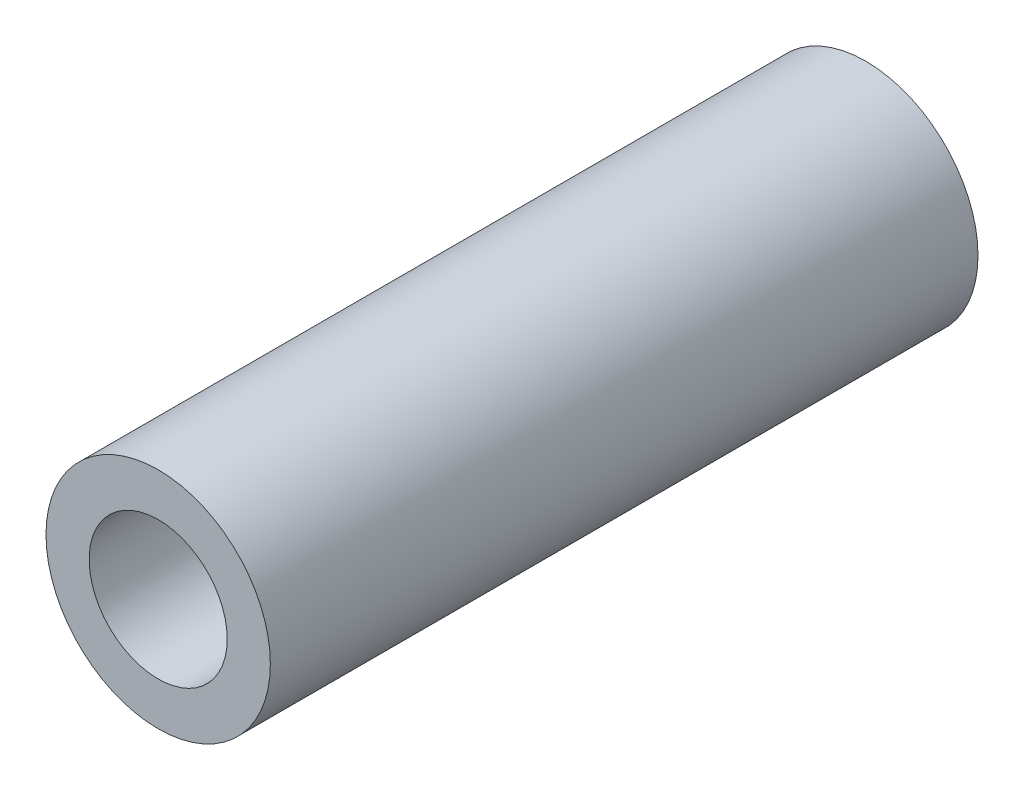
ISO-10303-21;
HEADER;
FILE_DESCRIPTION(('STEP AP214'),'2;1');
FILE_NAME('part.step','',(''),(''),'','','');
FILE_SCHEMA(('AUTOMOTIVE_DESIGN { 1 0 10303 214 1 1 1 1 }'));
ENDSEC;
DATA;
#1=APPLICATION_CONTEXT('core data for automotive mechanical design processes');
#2=APPLICATION_PROTOCOL_DEFINITION('international standard','automotive_design',2000,#1);
#3=PRODUCT_CONTEXT('',#1,'mechanical');
#4=PRODUCT('Part','Part','',(#3));
#5=PRODUCT_RELATED_PRODUCT_CATEGORY('part','',(#4));
#6=PRODUCT_DEFINITION_FORMATION('','',#4);
#7=PRODUCT_DEFINITION_CONTEXT('part definition',#1,'design');
#8=PRODUCT_DEFINITION('design','',#6,#7);
#9=PRODUCT_DEFINITION_SHAPE('','',#8);
#10=(LENGTH_UNIT() NAMED_UNIT(*) SI_UNIT(.MILLI.,.METRE.));
#11=(NAMED_UNIT(*) PLANE_ANGLE_UNIT() SI_UNIT($,.RADIAN.));
#12=(NAMED_UNIT(*) SI_UNIT($,.STERADIAN.) SOLID_ANGLE_UNIT());
#13=UNCERTAINTY_MEASURE_WITH_UNIT(LENGTH_MEASURE(1.E-05),#10,'distance_accuracy_value','');
#14=(GEOMETRIC_REPRESENTATION_CONTEXT(3) GLOBAL_UNCERTAINTY_ASSIGNED_CONTEXT((#13)) GLOBAL_UNIT_ASSIGNED_CONTEXT((#10,
#11,#12)) REPRESENTATION_CONTEXT('',''));
#15=CARTESIAN_POINT('',(0.,0.,0.));
#16=DIRECTION('',(0.,0.,1.));
#17=DIRECTION('',(1.,0.,0.));
#18=AXIS2_PLACEMENT_3D('',#15,#16,#17);
#19=CARTESIAN_POINT('',(-12.75,-12.75,22.));
#20=DIRECTION('',(0.,0.,1.));
#21=DIRECTION('',(1.,0.,0.));
#22=AXIS2_PLACEMENT_3D('',#19,#20,#21);
#23=PLANE('',#22);
#24=CARTESIAN_POINT('',(-12.75,-12.75,22.));
#25=DIRECTION('',(0.,0.,1.));
#26=DIRECTION('',(1.,0.,0.));
#27=AXIS2_PLACEMENT_3D('',#24,#25,#26);
#28=CIRCLE('',#27,1.6);
#29=CARTESIAN_POINT('',(-11.15,-12.75,22.));
#30=VERTEX_POINT('',#29);
#31=EDGE_CURVE('E23',#30,#30,#28,.T.);
#32=ORIENTED_EDGE('',*,*,#31,.F.);
#33=EDGE_LOOP('',(#32));
#34=FACE_BOUND('',#33,.T.);
#35=CARTESIAN_POINT('',(-12.75,-12.75,22.));
#36=DIRECTION('',(0.,0.,1.));
#37=DIRECTION('',(1.,0.,0.));
#38=AXIS2_PLACEMENT_3D('',#35,#36,#37);
#39=CIRCLE('',#38,2.6);
#40=CARTESIAN_POINT('',(-10.15,-12.75,22.));
#41=VERTEX_POINT('',#40);
#42=EDGE_CURVE('E57',#41,#41,#39,.T.);
#43=ORIENTED_EDGE('',*,*,#42,.T.);
#44=EDGE_LOOP('',(#43));
#45=FACE_BOUND('',#44,.T.);
#46=ADVANCED_FACE('F15',(#34,#45),#23,.T.);
#47=CARTESIAN_POINT('',(-12.75,-12.75,5.6));
#48=DIRECTION('',(0.,0.,1.));
#49=DIRECTION('',(1.,0.,0.));
#50=AXIS2_PLACEMENT_3D('',#47,#48,#49);
#51=PLANE('',#50);
#52=CARTESIAN_POINT('',(-12.75,-12.75,5.6));
#53=DIRECTION('',(0.,0.,1.));
#54=DIRECTION('',(1.,0.,0.));
#55=AXIS2_PLACEMENT_3D('',#52,#53,#54);
#56=CIRCLE('',#55,1.6);
#57=CARTESIAN_POINT('',(-11.15,-12.75,5.6));
#58=VERTEX_POINT('',#57);
#59=EDGE_CURVE('E9',#58,#58,#56,.T.);
#60=ORIENTED_EDGE('',*,*,#59,.T.);
#61=EDGE_LOOP('',(#60));
#62=FACE_BOUND('',#61,.T.);
#63=CARTESIAN_POINT('',(-12.75,-12.75,5.6));
#64=DIRECTION('',(0.,0.,1.));
#65=DIRECTION('',(1.,0.,0.));
#66=AXIS2_PLACEMENT_3D('',#63,#64,#65);
#67=CIRCLE('',#66,2.6);
#68=CARTESIAN_POINT('',(-10.15,-12.75,5.6));
#69=VERTEX_POINT('',#68);
#70=EDGE_CURVE('E54',#69,#69,#67,.T.);
#71=ORIENTED_EDGE('',*,*,#70,.F.);
#72=EDGE_LOOP('',(#71));
#73=FACE_BOUND('',#72,.T.);
#74=ADVANCED_FACE('F87',(#62,#73),#51,.F.);
#75=CARTESIAN_POINT('',(-12.75,-12.75,5.6));
#76=DIRECTION('',(0.,0.,-1.));
#77=DIRECTION('',(1.,0.,0.));
#78=AXIS2_PLACEMENT_3D('',#75,#76,#77);
#79=CYLINDRICAL_SURFACE('',#78,1.6);
#80=DIRECTION('',(0.,0.,1.));
#81=VECTOR('',#80,1.);
#82=CARTESIAN_POINT('',(-11.15,-12.75,5.6));
#83=LINE('',#82,#81);
#84=EDGE_CURVE('E62',#58,#30,#83,.T.);
#85=ORIENTED_EDGE('',*,*,#84,.T.);
#86=ORIENTED_EDGE('',*,*,#31,.T.);
#87=ORIENTED_EDGE('',*,*,#84,.F.);
#88=ORIENTED_EDGE('',*,*,#59,.F.);
#89=EDGE_LOOP('',(#85,#86,#87,#88));
#90=FACE_BOUND('',#89,.T.);
#91=ADVANCED_FACE('F77',(#90),#79,.F.);
#92=CARTESIAN_POINT('',(-12.75,-12.75,5.6));
#93=DIRECTION('',(0.,0.,-1.));
#94=DIRECTION('',(1.,0.,0.));
#95=AXIS2_PLACEMENT_3D('',#92,#93,#94);
#96=CYLINDRICAL_SURFACE('',#95,2.6);
#97=ORIENTED_EDGE('',*,*,#70,.T.);
#98=DIRECTION('',(0.,0.,1.));
#99=VECTOR('',#98,1.);
#100=CARTESIAN_POINT('',(-10.15,-12.75,5.6));
#101=LINE('',#100,#99);
#102=EDGE_CURVE('E55',#69,#41,#101,.T.);
#103=ORIENTED_EDGE('',*,*,#102,.T.);
#104=ORIENTED_EDGE('',*,*,#42,.F.);
#105=ORIENTED_EDGE('',*,*,#102,.F.);
#106=EDGE_LOOP('',(#97,#103,#104,#105));
#107=FACE_BOUND('',#106,.T.);
#108=ADVANCED_FACE('F52',(#107),#96,.T.);
#109=CLOSED_SHELL('',(#46,#74,#91,#108));
#110=MANIFOLD_SOLID_BREP('B1',#109);
#111=ADVANCED_BREP_SHAPE_REPRESENTATION('',(#18,#110),#14);
#112=SHAPE_DEFINITION_REPRESENTATION(#9,#111);
ENDSEC;
END-ISO-10303-21;
